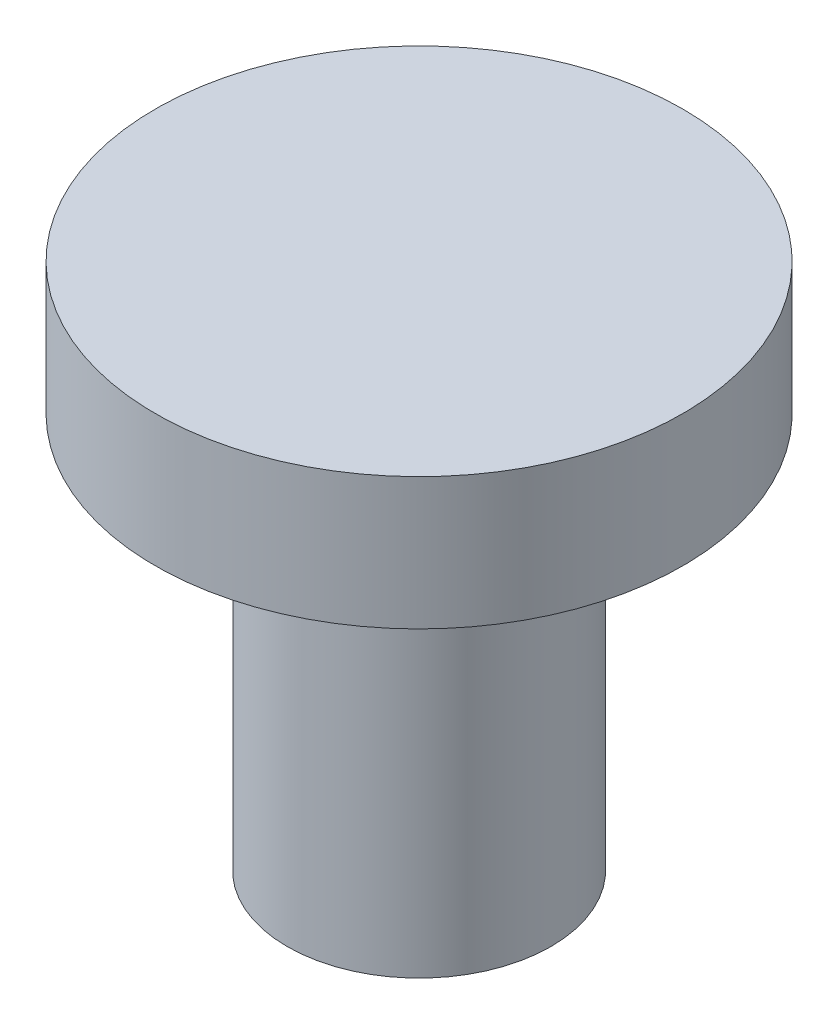
ISO-10303-21;
HEADER;
FILE_DESCRIPTION(('STEP AP214'),'2;1');
FILE_NAME('part.step','',(''),(''),'','','');
FILE_SCHEMA(('AUTOMOTIVE_DESIGN { 1 0 10303 214 1 1 1 1 }'));
ENDSEC;
DATA;
#1=APPLICATION_CONTEXT('core data for automotive mechanical design processes');
#2=APPLICATION_PROTOCOL_DEFINITION('international standard','automotive_design',2000,#1);
#3=PRODUCT_CONTEXT('',#1,'mechanical');
#4=PRODUCT('Part','Part','',(#3));
#5=PRODUCT_RELATED_PRODUCT_CATEGORY('part','',(#4));
#6=PRODUCT_DEFINITION_FORMATION('','',#4);
#7=PRODUCT_DEFINITION_CONTEXT('part definition',#1,'design');
#8=PRODUCT_DEFINITION('design','',#6,#7);
#9=PRODUCT_DEFINITION_SHAPE('','',#8);
#10=(LENGTH_UNIT() NAMED_UNIT(*) SI_UNIT(.MILLI.,.METRE.));
#11=(NAMED_UNIT(*) PLANE_ANGLE_UNIT() SI_UNIT($,.RADIAN.));
#12=(NAMED_UNIT(*) SI_UNIT($,.STERADIAN.) SOLID_ANGLE_UNIT());
#13=UNCERTAINTY_MEASURE_WITH_UNIT(LENGTH_MEASURE(1.E-05),#10,'distance_accuracy_value','');
#14=(GEOMETRIC_REPRESENTATION_CONTEXT(3) GLOBAL_UNCERTAINTY_ASSIGNED_CONTEXT((#13)) GLOBAL_UNIT_ASSIGNED_CONTEXT((#10,
#11,#12)) REPRESENTATION_CONTEXT('',''));
#15=CARTESIAN_POINT('',(0.,0.,0.));
#16=DIRECTION('',(0.,0.,1.));
#17=DIRECTION('',(1.,0.,0.));
#18=AXIS2_PLACEMENT_3D('',#15,#16,#17);
#19=CARTESIAN_POINT('',(0.,0.,0.));
#20=DIRECTION('',(0.,-1.,0.));
#21=DIRECTION('',(0.,0.,-1.));
#22=AXIS2_PLACEMENT_3D('',#19,#20,#21);
#23=PLANE('',#22);
#24=CARTESIAN_POINT('',(0.,0.,0.));
#25=DIRECTION('',(0.,-1.,0.));
#26=DIRECTION('',(0.,0.,-1.));
#27=AXIS2_PLACEMENT_3D('',#24,#25,#26);
#28=CIRCLE('',#27,1.);
#29=CARTESIAN_POINT('',(0.,0.,-1.));
#30=VERTEX_POINT('',#29);
#31=EDGE_CURVE('E45',#30,#30,#28,.T.);
#32=ORIENTED_EDGE('',*,*,#31,.T.);
#33=EDGE_LOOP('',(#32));
#34=FACE_BOUND('',#33,.T.);
#35=ADVANCED_FACE('F31',(#34),#23,.T.);
#36=CARTESIAN_POINT('',(0.,4.,0.));
#37=DIRECTION('',(0.,1.,0.));
#38=DIRECTION('',(0.,0.,1.));
#39=AXIS2_PLACEMENT_3D('',#36,#37,#38);
#40=PLANE('',#39);
#41=CARTESIAN_POINT('',(0.,4.,0.));
#42=DIRECTION('',(0.,-1.,0.));
#43=DIRECTION('',(0.,0.,-1.));
#44=AXIS2_PLACEMENT_3D('',#41,#42,#43);
#45=CIRCLE('',#44,2.);
#46=CARTESIAN_POINT('',(0.,4.,-2.));
#47=VERTEX_POINT('',#46);
#48=EDGE_CURVE('E10',#47,#47,#45,.T.);
#49=ORIENTED_EDGE('',*,*,#48,.F.);
#50=EDGE_LOOP('',(#49));
#51=FACE_BOUND('',#50,.T.);
#52=ADVANCED_FACE('F63',(#51),#40,.T.);
#53=CARTESIAN_POINT('',(0.,0.,0.));
#54=DIRECTION('',(0.,-1.,0.));
#55=DIRECTION('',(0.,0.,-1.));
#56=AXIS2_PLACEMENT_3D('',#53,#54,#55);
#57=CYLINDRICAL_SURFACE('',#56,2.);
#58=ORIENTED_EDGE('',*,*,#48,.T.);
#59=EDGE_LOOP('',(#58));
#60=FACE_BOUND('',#59,.T.);
#61=CARTESIAN_POINT('',(0.,3.,0.));
#62=DIRECTION('',(0.,-1.,0.));
#63=DIRECTION('',(0.,0.,-1.));
#64=AXIS2_PLACEMENT_3D('',#61,#62,#63);
#65=CIRCLE('',#64,2.);
#66=CARTESIAN_POINT('',(0.,3.,-2.));
#67=VERTEX_POINT('',#66);
#68=EDGE_CURVE('E37',#67,#67,#65,.T.);
#69=ORIENTED_EDGE('',*,*,#68,.F.);
#70=EDGE_LOOP('',(#69));
#71=FACE_BOUND('',#70,.T.);
#72=ADVANCED_FACE('F60',(#60,#71),#57,.T.);
#73=CARTESIAN_POINT('',(2.,3.,0.));
#74=DIRECTION('',(0.,-1.,0.));
#75=DIRECTION('',(0.,0.,-1.));
#76=AXIS2_PLACEMENT_3D('',#73,#74,#75);
#77=PLANE('',#76);
#78=ORIENTED_EDGE('',*,*,#68,.T.);
#79=EDGE_LOOP('',(#78));
#80=FACE_BOUND('',#79,.T.);
#81=CARTESIAN_POINT('',(0.,3.,0.));
#82=DIRECTION('',(0.,-1.,0.));
#83=DIRECTION('',(0.,0.,-1.));
#84=AXIS2_PLACEMENT_3D('',#81,#82,#83);
#85=CIRCLE('',#84,1.);
#86=CARTESIAN_POINT('',(0.,3.,-1.));
#87=VERTEX_POINT('',#86);
#88=EDGE_CURVE('E41',#87,#87,#85,.T.);
#89=ORIENTED_EDGE('',*,*,#88,.F.);
#90=EDGE_LOOP('',(#89));
#91=FACE_BOUND('',#90,.T.);
#92=ADVANCED_FACE('F54',(#80,#91),#77,.T.);
#93=CARTESIAN_POINT('',(0.,0.,0.));
#94=DIRECTION('',(0.,-1.,0.));
#95=DIRECTION('',(0.,0.,-1.));
#96=AXIS2_PLACEMENT_3D('',#93,#94,#95);
#97=CYLINDRICAL_SURFACE('',#96,1.);
#98=ORIENTED_EDGE('',*,*,#88,.T.);
#99=EDGE_LOOP('',(#98));
#100=FACE_BOUND('',#99,.T.);
#101=ORIENTED_EDGE('',*,*,#31,.F.);
#102=EDGE_LOOP('',(#101));
#103=FACE_BOUND('',#102,.T.);
#104=ADVANCED_FACE('F52',(#100,#103),#97,.T.);
#105=CLOSED_SHELL('',(#35,#52,#72,#92,#104));
#106=MANIFOLD_SOLID_BREP('B2',#105);
#107=ADVANCED_BREP_SHAPE_REPRESENTATION('',(#18,#106),#14);
#108=SHAPE_DEFINITION_REPRESENTATION(#9,#107);
ENDSEC;
END-ISO-10303-21;
